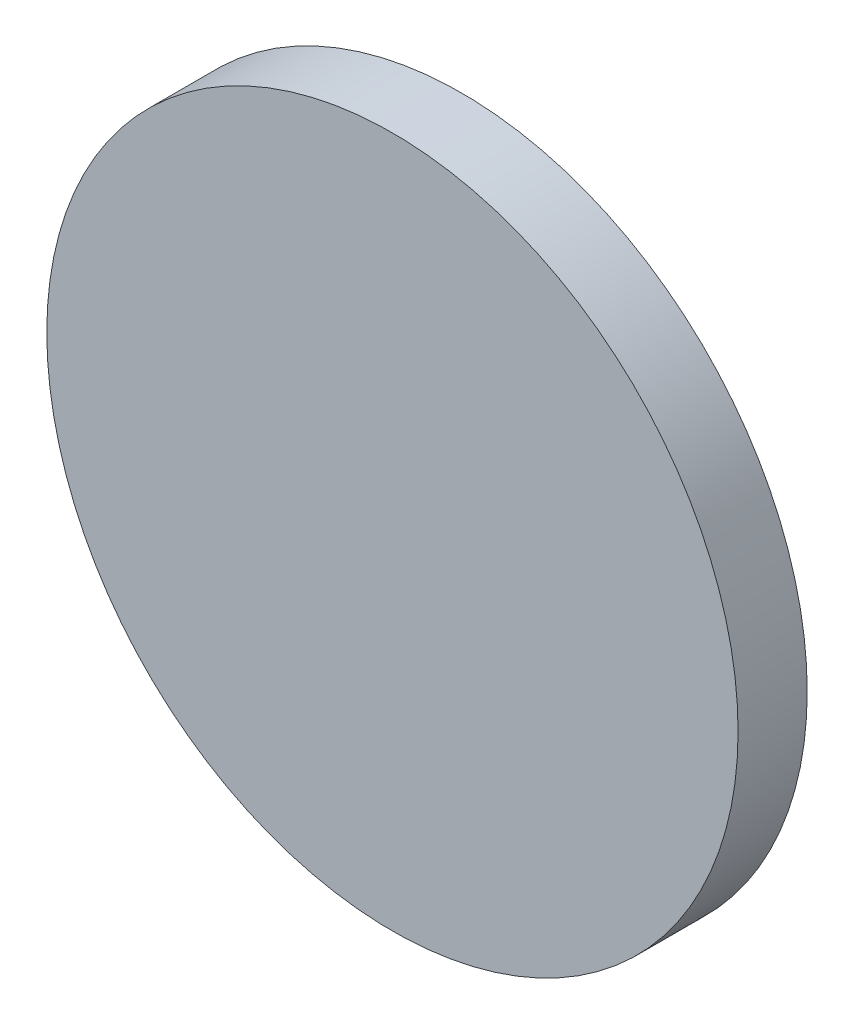
ISO-10303-21;
HEADER;
FILE_DESCRIPTION(('STEP AP214'),'2;1');
FILE_NAME('part.step','',(''),(''),'','','');
FILE_SCHEMA(('AUTOMOTIVE_DESIGN { 1 0 10303 214 1 1 1 1 }'));
ENDSEC;
DATA;
#1=APPLICATION_CONTEXT('core data for automotive mechanical design processes');
#2=APPLICATION_PROTOCOL_DEFINITION('international standard','automotive_design',2000,#1);
#3=PRODUCT_CONTEXT('',#1,'mechanical');
#4=PRODUCT('Part','Part','',(#3));
#5=PRODUCT_RELATED_PRODUCT_CATEGORY('part','',(#4));
#6=PRODUCT_DEFINITION_FORMATION('','',#4);
#7=PRODUCT_DEFINITION_CONTEXT('part definition',#1,'design');
#8=PRODUCT_DEFINITION('design','',#6,#7);
#9=PRODUCT_DEFINITION_SHAPE('','',#8);
#10=(LENGTH_UNIT() NAMED_UNIT(*) SI_UNIT(.MILLI.,.METRE.));
#11=(NAMED_UNIT(*) PLANE_ANGLE_UNIT() SI_UNIT($,.RADIAN.));
#12=(NAMED_UNIT(*) SI_UNIT($,.STERADIAN.) SOLID_ANGLE_UNIT());
#13=UNCERTAINTY_MEASURE_WITH_UNIT(LENGTH_MEASURE(1.E-05),#10,'distance_accuracy_value','');
#14=(GEOMETRIC_REPRESENTATION_CONTEXT(3) GLOBAL_UNCERTAINTY_ASSIGNED_CONTEXT((#13)) GLOBAL_UNIT_ASSIGNED_CONTEXT((#10,
#11,#12)) REPRESENTATION_CONTEXT('',''));
#15=CARTESIAN_POINT('',(0.,0.,0.));
#16=DIRECTION('',(0.,0.,1.));
#17=DIRECTION('',(1.,0.,0.));
#18=AXIS2_PLACEMENT_3D('',#15,#16,#17);
#19=CARTESIAN_POINT('',(0.,0.,50.8));
#20=DIRECTION('',(0.,0.,-1.));
#21=DIRECTION('',(-1.,0.,0.));
#22=AXIS2_PLACEMENT_3D('',#19,#20,#21);
#23=CYLINDRICAL_SURFACE('',#22,254.);
#24=CARTESIAN_POINT('',(0.,0.,50.8));
#25=DIRECTION('',(0.,0.,1.));
#26=DIRECTION('',(1.,0.,0.));
#27=AXIS2_PLACEMENT_3D('',#24,#25,#26);
#28=CIRCLE('',#27,254.);
#29=CARTESIAN_POINT('',(254.,0.,50.8));
#30=VERTEX_POINT('',#29);
#31=EDGE_CURVE('E10',#30,#30,#28,.T.);
#32=ORIENTED_EDGE('',*,*,#31,.F.);
#33=EDGE_LOOP('',(#32));
#34=FACE_BOUND('',#33,.T.);
#35=CARTESIAN_POINT('',(0.,0.,0.));
#36=DIRECTION('',(0.,0.,1.));
#37=DIRECTION('',(1.,0.,0.));
#38=AXIS2_PLACEMENT_3D('',#35,#36,#37);
#39=CIRCLE('',#38,254.);
#40=CARTESIAN_POINT('',(254.,0.,0.));
#41=VERTEX_POINT('',#40);
#42=EDGE_CURVE('E37',#41,#41,#39,.T.);
#43=ORIENTED_EDGE('',*,*,#42,.T.);
#44=EDGE_LOOP('',(#43));
#45=FACE_BOUND('',#44,.T.);
#46=ADVANCED_FACE('F34',(#34,#45),#23,.T.);
#47=CARTESIAN_POINT('',(0.,0.,50.8));
#48=DIRECTION('',(0.,0.,1.));
#49=DIRECTION('',(1.,0.,0.));
#50=AXIS2_PLACEMENT_3D('',#47,#48,#49);
#51=PLANE('',#50);
#52=ORIENTED_EDGE('',*,*,#31,.T.);
#53=EDGE_LOOP('',(#52));
#54=FACE_BOUND('',#53,.T.);
#55=ADVANCED_FACE('F49',(#54),#51,.T.);
#56=CARTESIAN_POINT('',(0.,0.,0.));
#57=DIRECTION('',(0.,0.,1.));
#58=DIRECTION('',(1.,0.,0.));
#59=AXIS2_PLACEMENT_3D('',#56,#57,#58);
#60=PLANE('',#59);
#61=ORIENTED_EDGE('',*,*,#42,.F.);
#62=EDGE_LOOP('',(#61));
#63=FACE_BOUND('',#62,.T.);
#64=ADVANCED_FACE('F47',(#63),#60,.F.);
#65=CLOSED_SHELL('',(#46,#55,#64));
#66=MANIFOLD_SOLID_BREP('B2',#65);
#67=ADVANCED_BREP_SHAPE_REPRESENTATION('',(#18,#66),#14);
#68=SHAPE_DEFINITION_REPRESENTATION(#9,#67);
ENDSEC;
END-ISO-10303-21;
